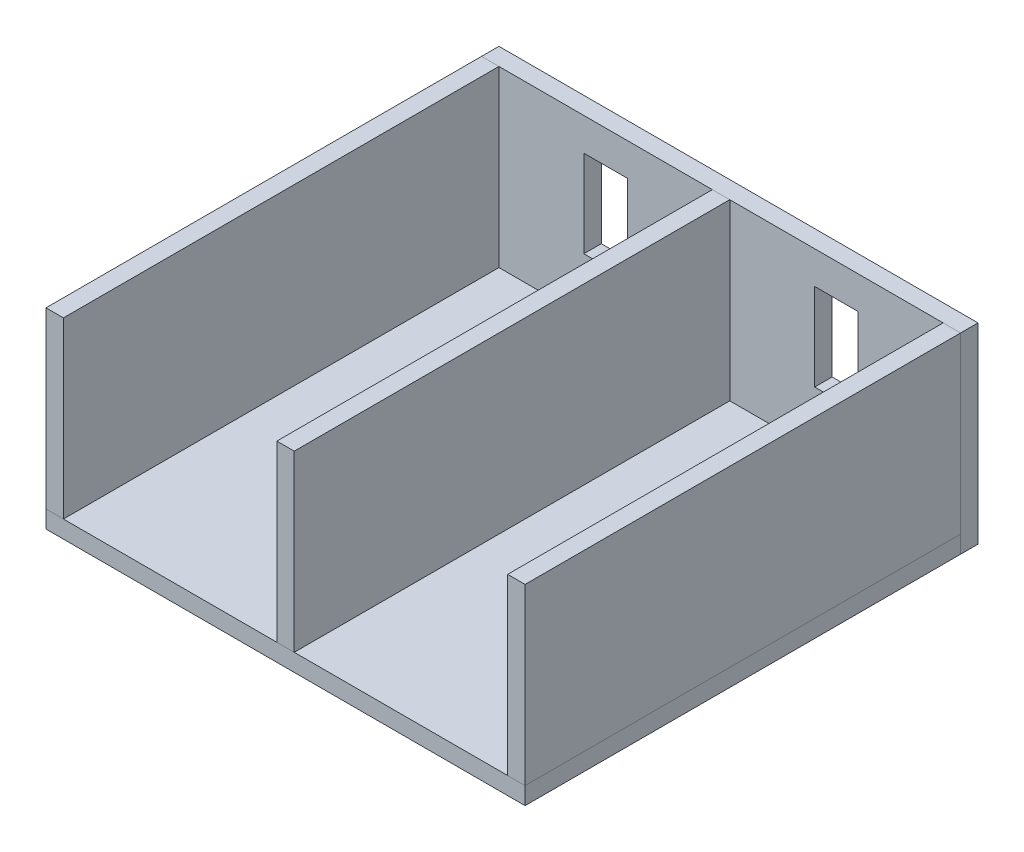
ISO-10303-21;
HEADER;
FILE_DESCRIPTION(('STEP AP214'),'2;1');
FILE_NAME('part.step','',(''),(''),'','','');
FILE_SCHEMA(('AUTOMOTIVE_DESIGN { 1 0 10303 214 1 1 1 1 }'));
ENDSEC;
DATA;
#1=APPLICATION_CONTEXT('core data for automotive mechanical design processes');
#2=APPLICATION_PROTOCOL_DEFINITION('international standard','automotive_design',2000,#1);
#3=PRODUCT_CONTEXT('',#1,'mechanical');
#4=PRODUCT('Part','Part','',(#3));
#5=PRODUCT_RELATED_PRODUCT_CATEGORY('part','',(#4));
#6=PRODUCT_DEFINITION_FORMATION('','',#4);
#7=PRODUCT_DEFINITION_CONTEXT('part definition',#1,'design');
#8=PRODUCT_DEFINITION('design','',#6,#7);
#9=PRODUCT_DEFINITION_SHAPE('','',#8);
#10=(LENGTH_UNIT() NAMED_UNIT(*) SI_UNIT(.MILLI.,.METRE.));
#11=(NAMED_UNIT(*) PLANE_ANGLE_UNIT() SI_UNIT($,.RADIAN.));
#12=(NAMED_UNIT(*) SI_UNIT($,.STERADIAN.) SOLID_ANGLE_UNIT());
#13=UNCERTAINTY_MEASURE_WITH_UNIT(LENGTH_MEASURE(1.E-05),#10,'distance_accuracy_value','');
#14=(GEOMETRIC_REPRESENTATION_CONTEXT(3) GLOBAL_UNCERTAINTY_ASSIGNED_CONTEXT((#13)) GLOBAL_UNIT_ASSIGNED_CONTEXT((#10,
#11,#12)) REPRESENTATION_CONTEXT('',''));
#15=CARTESIAN_POINT('',(0.,0.,0.));
#16=DIRECTION('',(0.,0.,1.));
#17=DIRECTION('',(1.,0.,0.));
#18=AXIS2_PLACEMENT_3D('',#15,#16,#17);
#19=CARTESIAN_POINT('',(110.,88.,-108.));
#20=DIRECTION('',(-1.,0.,0.));
#21=DIRECTION('',(0.,-1.,0.));
#22=AXIS2_PLACEMENT_3D('',#19,#20,#21);
#23=PLANE('',#22);
#24=DIRECTION('',(0.,-1.,0.));
#25=VECTOR('',#24,1.);
#26=CARTESIAN_POINT('',(110.,88.,-100.));
#27=LINE('',#26,#25);
#28=CARTESIAN_POINT('',(110.,88.,-100.));
#29=VERTEX_POINT('',#28);
#30=CARTESIAN_POINT('',(110.,0.,-100.));
#31=VERTEX_POINT('',#30);
#32=EDGE_CURVE('E176',#29,#31,#27,.T.);
#33=ORIENTED_EDGE('',*,*,#32,.T.);
#34=DIRECTION('',(0.,0.,1.));
#35=VECTOR('',#34,1.);
#36=CARTESIAN_POINT('',(110.,0.,-108.));
#37=LINE('',#36,#35);
#38=CARTESIAN_POINT('',(110.,0.,-108.));
#39=VERTEX_POINT('',#38);
#40=EDGE_CURVE('E243',#39,#31,#37,.T.);
#41=ORIENTED_EDGE('',*,*,#40,.F.);
#42=DIRECTION('',(0.,-1.,0.));
#43=VECTOR('',#42,1.);
#44=CARTESIAN_POINT('',(110.,88.,-108.));
#45=LINE('',#44,#43);
#46=CARTESIAN_POINT('',(110.,88.,-108.));
#47=VERTEX_POINT('',#46);
#48=EDGE_CURVE('E206',#47,#39,#45,.T.);
#49=ORIENTED_EDGE('',*,*,#48,.F.);
#50=DIRECTION('',(0.,0.,1.));
#51=VECTOR('',#50,1.);
#52=CARTESIAN_POINT('',(110.,88.,-108.));
#53=LINE('',#52,#51);
#54=EDGE_CURVE('E220',#47,#29,#53,.T.);
#55=ORIENTED_EDGE('',*,*,#54,.T.);
#56=EDGE_LOOP('',(#33,#41,#49,#55));
#57=FACE_BOUND('',#56,.T.);
#58=ADVANCED_FACE('F49',(#57),#23,.F.);
#59=CARTESIAN_POINT('',(110.,0.,-108.));
#60=DIRECTION('',(0.,1.,0.));
#61=DIRECTION('',(0.,0.,1.));
#62=AXIS2_PLACEMENT_3D('',#59,#60,#61);
#63=PLANE('',#62);
#64=DIRECTION('',(-1.,0.,0.));
#65=VECTOR('',#64,1.);
#66=CARTESIAN_POINT('',(110.,0.,-100.));
#67=LINE('',#66,#65);
#68=CARTESIAN_POINT('',(-110.,0.,-100.));
#69=VERTEX_POINT('',#68);
#70=EDGE_CURVE('E224',#31,#69,#67,.T.);
#71=ORIENTED_EDGE('',*,*,#70,.T.);
#72=DIRECTION('',(0.,0.,1.));
#73=VECTOR('',#72,1.);
#74=CARTESIAN_POINT('',(-110.,0.,-108.));
#75=LINE('',#74,#73);
#76=CARTESIAN_POINT('',(-110.,0.,-108.));
#77=VERTEX_POINT('',#76);
#78=EDGE_CURVE('E239',#77,#69,#75,.T.);
#79=ORIENTED_EDGE('',*,*,#78,.F.);
#80=DIRECTION('',(-1.,0.,0.));
#81=VECTOR('',#80,1.);
#82=CARTESIAN_POINT('',(110.,0.,-108.));
#83=LINE('',#82,#81);
#84=EDGE_CURVE('E210',#39,#77,#83,.T.);
#85=ORIENTED_EDGE('',*,*,#84,.F.);
#86=ORIENTED_EDGE('',*,*,#40,.T.);
#87=EDGE_LOOP('',(#71,#79,#85,#86));
#88=FACE_BOUND('',#87,.T.);
#89=ADVANCED_FACE('F289',(#88),#63,.F.);
#90=CARTESIAN_POINT('',(-110.,88.,-108.));
#91=DIRECTION('',(1.,0.,0.));
#92=DIRECTION('',(0.,1.,0.));
#93=AXIS2_PLACEMENT_3D('',#90,#91,#92);
#94=PLANE('',#93);
#95=DIRECTION('',(0.,1.,0.));
#96=VECTOR('',#95,1.);
#97=CARTESIAN_POINT('',(-110.,88.,-100.));
#98=LINE('',#97,#96);
#99=CARTESIAN_POINT('',(-110.,88.,-100.));
#100=VERTEX_POINT('',#99);
#101=EDGE_CURVE('E227',#69,#100,#98,.T.);
#102=ORIENTED_EDGE('',*,*,#101,.T.);
#103=DIRECTION('',(0.,0.,1.));
#104=VECTOR('',#103,1.);
#105=CARTESIAN_POINT('',(-110.,88.,-108.));
#106=LINE('',#105,#104);
#107=CARTESIAN_POINT('',(-110.,88.,-108.));
#108=VERTEX_POINT('',#107);
#109=EDGE_CURVE('E235',#108,#100,#106,.T.);
#110=ORIENTED_EDGE('',*,*,#109,.F.);
#111=DIRECTION('',(0.,1.,0.));
#112=VECTOR('',#111,1.);
#113=CARTESIAN_POINT('',(-110.,88.,-108.));
#114=LINE('',#113,#112);
#115=EDGE_CURVE('E214',#77,#108,#114,.T.);
#116=ORIENTED_EDGE('',*,*,#115,.F.);
#117=ORIENTED_EDGE('',*,*,#78,.T.);
#118=EDGE_LOOP('',(#102,#110,#116,#117));
#119=FACE_BOUND('',#118,.T.);
#120=ADVANCED_FACE('F294',(#119),#94,.F.);
#121=CARTESIAN_POINT('',(110.,88.,-108.));
#122=DIRECTION('',(0.,-1.,0.));
#123=DIRECTION('',(0.,0.,-1.));
#124=AXIS2_PLACEMENT_3D('',#121,#122,#123);
#125=PLANE('',#124);
#126=DIRECTION('',(1.,0.,0.));
#127=VECTOR('',#126,1.);
#128=CARTESIAN_POINT('',(110.,88.,-100.));
#129=LINE('',#128,#127);
#130=EDGE_CURVE('E211',#100,#29,#129,.T.);
#131=ORIENTED_EDGE('',*,*,#130,.T.);
#132=ORIENTED_EDGE('',*,*,#54,.F.);
#133=DIRECTION('',(1.,0.,0.));
#134=VECTOR('',#133,1.);
#135=CARTESIAN_POINT('',(110.,88.,-108.));
#136=LINE('',#135,#134);
#137=EDGE_CURVE('E217',#108,#47,#136,.T.);
#138=ORIENTED_EDGE('',*,*,#137,.F.);
#139=ORIENTED_EDGE('',*,*,#109,.T.);
#140=EDGE_LOOP('',(#131,#132,#138,#139));
#141=FACE_BOUND('',#140,.T.);
#142=ADVANCED_FACE('F309',(#141),#125,.F.);
#143=CARTESIAN_POINT('',(0.,0.,-108.));
#144=DIRECTION('',(0.,0.,-1.));
#145=DIRECTION('',(-1.,0.,0.));
#146=AXIS2_PLACEMENT_3D('',#143,#144,#145);
#147=PLANE('',#146);
#148=DIRECTION('',(0.,-1.,0.));
#149=VECTOR('',#148,1.);
#150=CARTESIAN_POINT('',(-43.,33.,-108.));
#151=LINE('',#150,#149);
#152=CARTESIAN_POINT('',(-43.,73.,-108.));
#153=VERTEX_POINT('',#152);
#154=CARTESIAN_POINT('',(-43.,33.,-108.));
#155=VERTEX_POINT('',#154);
#156=EDGE_CURVE('E64',#153,#155,#151,.T.);
#157=ORIENTED_EDGE('',*,*,#156,.F.);
#158=DIRECTION('',(1.,0.,0.));
#159=VECTOR('',#158,1.);
#160=CARTESIAN_POINT('',(-63.,73.,-108.));
#161=LINE('',#160,#159);
#162=CARTESIAN_POINT('',(-63.,73.,-108.));
#163=VERTEX_POINT('',#162);
#164=EDGE_CURVE('E164',#163,#153,#161,.T.);
#165=ORIENTED_EDGE('',*,*,#164,.F.);
#166=DIRECTION('',(0.,1.,0.));
#167=VECTOR('',#166,1.);
#168=CARTESIAN_POINT('',(-63.,33.,-108.));
#169=LINE('',#168,#167);
#170=CARTESIAN_POINT('',(-63.,33.,-108.));
#171=VERTEX_POINT('',#170);
#172=EDGE_CURVE('E145',#171,#163,#169,.T.);
#173=ORIENTED_EDGE('',*,*,#172,.F.);
#174=DIRECTION('',(-1.,0.,0.));
#175=VECTOR('',#174,1.);
#176=CARTESIAN_POINT('',(-63.,33.,-108.));
#177=LINE('',#176,#175);
#178=EDGE_CURVE('E156',#155,#171,#177,.T.);
#179=ORIENTED_EDGE('',*,*,#178,.F.);
#180=EDGE_LOOP('',(#157,#165,#173,#179));
#181=FACE_BOUND('',#180,.T.);
#182=DIRECTION('',(0.,-1.,0.));
#183=VECTOR('',#182,1.);
#184=CARTESIAN_POINT('',(63.,33.,-108.));
#185=LINE('',#184,#183);
#186=CARTESIAN_POINT('',(63.,73.,-108.));
#187=VERTEX_POINT('',#186);
#188=CARTESIAN_POINT('',(63.,33.,-108.));
#189=VERTEX_POINT('',#188);
#190=EDGE_CURVE('E72',#187,#189,#185,.T.);
#191=ORIENTED_EDGE('',*,*,#190,.F.);
#192=DIRECTION('',(1.,0.,0.));
#193=VECTOR('',#192,1.);
#194=CARTESIAN_POINT('',(43.,73.,-108.));
#195=LINE('',#194,#193);
#196=CARTESIAN_POINT('',(43.,73.,-108.));
#197=VERTEX_POINT('',#196);
#198=EDGE_CURVE('E191',#197,#187,#195,.T.);
#199=ORIENTED_EDGE('',*,*,#198,.F.);
#200=DIRECTION('',(0.,1.,0.));
#201=VECTOR('',#200,1.);
#202=CARTESIAN_POINT('',(43.,33.,-108.));
#203=LINE('',#202,#201);
#204=CARTESIAN_POINT('',(43.,33.,-108.));
#205=VERTEX_POINT('',#204);
#206=EDGE_CURVE('E187',#205,#197,#203,.T.);
#207=ORIENTED_EDGE('',*,*,#206,.F.);
#208=DIRECTION('',(-1.,0.,0.));
#209=VECTOR('',#208,1.);
#210=CARTESIAN_POINT('',(43.,33.,-108.));
#211=LINE('',#210,#209);
#212=EDGE_CURVE('E183',#189,#205,#211,.T.);
#213=ORIENTED_EDGE('',*,*,#212,.F.);
#214=EDGE_LOOP('',(#191,#199,#207,#213));
#215=FACE_BOUND('',#214,.T.);
#216=ORIENTED_EDGE('',*,*,#48,.T.);
#217=ORIENTED_EDGE('',*,*,#84,.T.);
#218=ORIENTED_EDGE('',*,*,#115,.T.);
#219=ORIENTED_EDGE('',*,*,#137,.T.);
#220=EDGE_LOOP('',(#216,#217,#218,#219));
#221=FACE_BOUND('',#220,.T.);
#222=ADVANCED_FACE('F161',(#181,#215,#221),#147,.T.);
#223=CARTESIAN_POINT('',(0.,0.,-100.));
#224=DIRECTION('',(0.,0.,-1.));
#225=DIRECTION('',(-1.,0.,0.));
#226=AXIS2_PLACEMENT_3D('',#223,#224,#225);
#227=PLANE('',#226);
#228=DIRECTION('',(1.,0.,0.));
#229=VECTOR('',#228,1.);
#230=CARTESIAN_POINT('',(0.,73.,-100.));
#231=LINE('',#230,#229);
#232=CARTESIAN_POINT('',(-63.,73.,-100.));
#233=VERTEX_POINT('',#232);
#234=CARTESIAN_POINT('',(-43.,73.,-100.));
#235=VERTEX_POINT('',#234);
#236=EDGE_CURVE('E57',#233,#235,#231,.T.);
#237=ORIENTED_EDGE('',*,*,#236,.T.);
#238=DIRECTION('',(0.,-1.,0.));
#239=VECTOR('',#238,1.);
#240=CARTESIAN_POINT('',(-43.,0.,-100.));
#241=LINE('',#240,#239);
#242=CARTESIAN_POINT('',(-43.,33.,-100.));
#243=VERTEX_POINT('',#242);
#244=EDGE_CURVE('E12',#235,#243,#241,.T.);
#245=ORIENTED_EDGE('',*,*,#244,.T.);
#246=DIRECTION('',(-1.,0.,0.));
#247=VECTOR('',#246,1.);
#248=CARTESIAN_POINT('',(0.,33.,-100.));
#249=LINE('',#248,#247);
#250=CARTESIAN_POINT('',(-63.,33.,-100.));
#251=VERTEX_POINT('',#250);
#252=EDGE_CURVE('E262',#243,#251,#249,.T.);
#253=ORIENTED_EDGE('',*,*,#252,.T.);
#254=DIRECTION('',(0.,1.,0.));
#255=VECTOR('',#254,1.);
#256=CARTESIAN_POINT('',(-63.,0.,-100.));
#257=LINE('',#256,#255);
#258=EDGE_CURVE('E148',#251,#233,#257,.T.);
#259=ORIENTED_EDGE('',*,*,#258,.T.);
#260=EDGE_LOOP('',(#237,#245,#253,#259));
#261=FACE_BOUND('',#260,.T.);
#262=DIRECTION('',(1.,0.,0.));
#263=VECTOR('',#262,1.);
#264=CARTESIAN_POINT('',(0.,73.,-100.));
#265=LINE('',#264,#263);
#266=CARTESIAN_POINT('',(43.,73.,-100.));
#267=VERTEX_POINT('',#266);
#268=CARTESIAN_POINT('',(63.,73.,-100.));
#269=VERTEX_POINT('',#268);
#270=EDGE_CURVE('E255',#267,#269,#265,.T.);
#271=ORIENTED_EDGE('',*,*,#270,.T.);
#272=DIRECTION('',(0.,-1.,0.));
#273=VECTOR('',#272,1.);
#274=CARTESIAN_POINT('',(63.,0.,-100.));
#275=LINE('',#274,#273);
#276=CARTESIAN_POINT('',(63.,33.,-100.));
#277=VERTEX_POINT('',#276);
#278=EDGE_CURVE('E258',#269,#277,#275,.T.);
#279=ORIENTED_EDGE('',*,*,#278,.T.);
#280=DIRECTION('',(-1.,0.,0.));
#281=VECTOR('',#280,1.);
#282=CARTESIAN_POINT('',(0.,33.,-100.));
#283=LINE('',#282,#281);
#284=CARTESIAN_POINT('',(43.,33.,-100.));
#285=VERTEX_POINT('',#284);
#286=EDGE_CURVE('E247',#277,#285,#283,.T.);
#287=ORIENTED_EDGE('',*,*,#286,.T.);
#288=DIRECTION('',(0.,1.,0.));
#289=VECTOR('',#288,1.);
#290=CARTESIAN_POINT('',(43.,0.,-100.));
#291=LINE('',#290,#289);
#292=EDGE_CURVE('E251',#285,#267,#291,.T.);
#293=ORIENTED_EDGE('',*,*,#292,.T.);
#294=EDGE_LOOP('',(#271,#279,#287,#293));
#295=FACE_BOUND('',#294,.T.);
#296=ORIENTED_EDGE('',*,*,#32,.F.);
#297=ORIENTED_EDGE('',*,*,#130,.F.);
#298=ORIENTED_EDGE('',*,*,#101,.F.);
#299=ORIENTED_EDGE('',*,*,#70,.F.);
#300=EDGE_LOOP('',(#296,#297,#298,#299));
#301=FACE_BOUND('',#300,.T.);
#302=ADVANCED_FACE('F269',(#261,#295,#301),#227,.F.);
#303=CARTESIAN_POINT('',(63.,33.,100.));
#304=DIRECTION('',(1.,0.,0.));
#305=DIRECTION('',(0.,0.,-1.));
#306=AXIS2_PLACEMENT_3D('',#303,#304,#305);
#307=PLANE('',#306);
#308=DIRECTION('',(0.,0.,-1.));
#309=VECTOR('',#308,1.);
#310=CARTESIAN_POINT('',(63.,73.,100.));
#311=LINE('',#310,#309);
#312=EDGE_CURVE('E196',#269,#187,#311,.T.);
#313=ORIENTED_EDGE('',*,*,#312,.T.);
#314=ORIENTED_EDGE('',*,*,#190,.T.);
#315=DIRECTION('',(0.,0.,-1.));
#316=VECTOR('',#315,1.);
#317=CARTESIAN_POINT('',(63.,33.,100.));
#318=LINE('',#317,#316);
#319=EDGE_CURVE('E195',#277,#189,#318,.T.);
#320=ORIENTED_EDGE('',*,*,#319,.F.);
#321=ORIENTED_EDGE('',*,*,#278,.F.);
#322=EDGE_LOOP('',(#313,#314,#320,#321));
#323=FACE_BOUND('',#322,.T.);
#324=ADVANCED_FACE('F320',(#323),#307,.F.);
#325=CARTESIAN_POINT('',(43.,73.,100.));
#326=DIRECTION('',(0.,1.,0.));
#327=DIRECTION('',(0.,0.,1.));
#328=AXIS2_PLACEMENT_3D('',#325,#326,#327);
#329=PLANE('',#328);
#330=DIRECTION('',(0.,0.,-1.));
#331=VECTOR('',#330,1.);
#332=CARTESIAN_POINT('',(43.,73.,100.));
#333=LINE('',#332,#331);
#334=EDGE_CURVE('E199',#267,#197,#333,.T.);
#335=ORIENTED_EDGE('',*,*,#334,.T.);
#336=ORIENTED_EDGE('',*,*,#198,.T.);
#337=ORIENTED_EDGE('',*,*,#312,.F.);
#338=ORIENTED_EDGE('',*,*,#270,.F.);
#339=EDGE_LOOP('',(#335,#336,#337,#338));
#340=FACE_BOUND('',#339,.T.);
#341=ADVANCED_FACE('F324',(#340),#329,.F.);
#342=CARTESIAN_POINT('',(43.,33.,100.));
#343=DIRECTION('',(-1.,0.,0.));
#344=DIRECTION('',(0.,0.,1.));
#345=AXIS2_PLACEMENT_3D('',#342,#343,#344);
#346=PLANE('',#345);
#347=DIRECTION('',(0.,0.,-1.));
#348=VECTOR('',#347,1.);
#349=CARTESIAN_POINT('',(43.,33.,100.));
#350=LINE('',#349,#348);
#351=EDGE_CURVE('E201',#285,#205,#350,.T.);
#352=ORIENTED_EDGE('',*,*,#351,.T.);
#353=ORIENTED_EDGE('',*,*,#206,.T.);
#354=ORIENTED_EDGE('',*,*,#334,.F.);
#355=ORIENTED_EDGE('',*,*,#292,.F.);
#356=EDGE_LOOP('',(#352,#353,#354,#355));
#357=FACE_BOUND('',#356,.T.);
#358=ADVANCED_FACE('F283',(#357),#346,.F.);
#359=CARTESIAN_POINT('',(43.,33.,100.));
#360=DIRECTION('',(0.,-1.,0.));
#361=DIRECTION('',(0.,0.,-1.));
#362=AXIS2_PLACEMENT_3D('',#359,#360,#361);
#363=PLANE('',#362);
#364=ORIENTED_EDGE('',*,*,#319,.T.);
#365=ORIENTED_EDGE('',*,*,#212,.T.);
#366=ORIENTED_EDGE('',*,*,#351,.F.);
#367=ORIENTED_EDGE('',*,*,#286,.F.);
#368=EDGE_LOOP('',(#364,#365,#366,#367));
#369=FACE_BOUND('',#368,.T.);
#370=ADVANCED_FACE('F276',(#369),#363,.F.);
#371=CARTESIAN_POINT('',(-43.,33.,100.));
#372=DIRECTION('',(1.,0.,0.));
#373=DIRECTION('',(0.,0.,-1.));
#374=AXIS2_PLACEMENT_3D('',#371,#372,#373);
#375=PLANE('',#374);
#376=DIRECTION('',(0.,0.,-1.));
#377=VECTOR('',#376,1.);
#378=CARTESIAN_POINT('',(-43.,73.,100.));
#379=LINE('',#378,#377);
#380=EDGE_CURVE('E173',#235,#153,#379,.T.);
#381=ORIENTED_EDGE('',*,*,#380,.T.);
#382=ORIENTED_EDGE('',*,*,#156,.T.);
#383=DIRECTION('',(0.,0.,-1.));
#384=VECTOR('',#383,1.);
#385=CARTESIAN_POINT('',(-43.,33.,100.));
#386=LINE('',#385,#384);
#387=EDGE_CURVE('E153',#243,#155,#386,.T.);
#388=ORIENTED_EDGE('',*,*,#387,.F.);
#389=ORIENTED_EDGE('',*,*,#244,.F.);
#390=EDGE_LOOP('',(#381,#382,#388,#389));
#391=FACE_BOUND('',#390,.T.);
#392=ADVANCED_FACE('F274',(#391),#375,.F.);
#393=CARTESIAN_POINT('',(-63.,73.,100.));
#394=DIRECTION('',(0.,1.,0.));
#395=DIRECTION('',(0.,0.,1.));
#396=AXIS2_PLACEMENT_3D('',#393,#394,#395);
#397=PLANE('',#396);
#398=DIRECTION('',(0.,0.,-1.));
#399=VECTOR('',#398,1.);
#400=CARTESIAN_POINT('',(-63.,73.,100.));
#401=LINE('',#400,#399);
#402=EDGE_CURVE('E152',#233,#163,#401,.T.);
#403=ORIENTED_EDGE('',*,*,#402,.T.);
#404=ORIENTED_EDGE('',*,*,#164,.T.);
#405=ORIENTED_EDGE('',*,*,#380,.F.);
#406=ORIENTED_EDGE('',*,*,#236,.F.);
#407=EDGE_LOOP('',(#403,#404,#405,#406));
#408=FACE_BOUND('',#407,.T.);
#409=ADVANCED_FACE('F273',(#408),#397,.F.);
#410=CARTESIAN_POINT('',(-63.,33.,100.));
#411=DIRECTION('',(-1.,0.,0.));
#412=DIRECTION('',(0.,0.,1.));
#413=AXIS2_PLACEMENT_3D('',#410,#411,#412);
#414=PLANE('',#413);
#415=DIRECTION('',(0.,0.,-1.));
#416=VECTOR('',#415,1.);
#417=CARTESIAN_POINT('',(-63.,33.,100.));
#418=LINE('',#417,#416);
#419=EDGE_CURVE('E140',#251,#171,#418,.T.);
#420=ORIENTED_EDGE('',*,*,#419,.T.);
#421=ORIENTED_EDGE('',*,*,#172,.T.);
#422=ORIENTED_EDGE('',*,*,#402,.F.);
#423=ORIENTED_EDGE('',*,*,#258,.F.);
#424=EDGE_LOOP('',(#420,#421,#422,#423));
#425=FACE_BOUND('',#424,.T.);
#426=ADVANCED_FACE('F142',(#425),#414,.F.);
#427=CARTESIAN_POINT('',(-63.,33.,100.));
#428=DIRECTION('',(0.,-1.,0.));
#429=DIRECTION('',(0.,0.,-1.));
#430=AXIS2_PLACEMENT_3D('',#427,#428,#429);
#431=PLANE('',#430);
#432=ORIENTED_EDGE('',*,*,#387,.T.);
#433=ORIENTED_EDGE('',*,*,#178,.T.);
#434=ORIENTED_EDGE('',*,*,#419,.F.);
#435=ORIENTED_EDGE('',*,*,#252,.F.);
#436=EDGE_LOOP('',(#432,#433,#434,#435));
#437=FACE_BOUND('',#436,.T.);
#438=ADVANCED_FACE('F157',(#437),#431,.F.);
#439=CLOSED_SHELL('',(#58,#89,#120,#142,#222,#302,#324,#341,#358,#370,#392,#409,#426,#438));
#440=MANIFOLD_SOLID_BREP('B2',#439);
#441=CARTESIAN_POINT('',(4.,88.,100.));
#442=DIRECTION('',(-1.,0.,0.));
#443=DIRECTION('',(0.,0.,1.));
#444=AXIS2_PLACEMENT_3D('',#441,#442,#443);
#445=PLANE('',#444);
#446=DIRECTION('',(0.,0.,-1.));
#447=VECTOR('',#446,1.);
#448=CARTESIAN_POINT('',(4.,8.,100.));
#449=LINE('',#448,#447);
#450=CARTESIAN_POINT('',(4.,8.,100.));
#451=VERTEX_POINT('',#450);
#452=CARTESIAN_POINT('',(4.,8.,-100.));
#453=VERTEX_POINT('',#452);
#454=EDGE_CURVE('E513',#451,#453,#449,.T.);
#455=ORIENTED_EDGE('',*,*,#454,.T.);
#456=DIRECTION('',(0.,-1.,0.));
#457=VECTOR('',#456,1.);
#458=CARTESIAN_POINT('',(4.,88.,-100.));
#459=LINE('',#458,#457);
#460=CARTESIAN_POINT('',(4.,88.,-100.));
#461=VERTEX_POINT('',#460);
#462=EDGE_CURVE('E47',#461,#453,#459,.T.);
#463=ORIENTED_EDGE('',*,*,#462,.F.);
#464=DIRECTION('',(0.,0.,-1.));
#465=VECTOR('',#464,1.);
#466=CARTESIAN_POINT('',(4.,88.,100.));
#467=LINE('',#466,#465);
#468=CARTESIAN_POINT('',(4.,88.,100.));
#469=VERTEX_POINT('',#468);
#470=EDGE_CURVE('E496',#469,#461,#467,.T.);
#471=ORIENTED_EDGE('',*,*,#470,.F.);
#472=DIRECTION('',(0.,-1.,0.));
#473=VECTOR('',#472,1.);
#474=CARTESIAN_POINT('',(4.,88.,100.));
#475=LINE('',#474,#473);
#476=EDGE_CURVE('E509',#469,#451,#475,.T.);
#477=ORIENTED_EDGE('',*,*,#476,.T.);
#478=EDGE_LOOP('',(#455,#463,#471,#477));
#479=FACE_BOUND('',#478,.T.);
#480=ADVANCED_FACE('F444',(#479),#445,.F.);
#481=CARTESIAN_POINT('',(-4.,88.,-100.));
#482=DIRECTION('',(0.,0.,1.));
#483=DIRECTION('',(1.,0.,0.));
#484=AXIS2_PLACEMENT_3D('',#481,#482,#483);
#485=PLANE('',#484);
#486=DIRECTION('',(-1.,0.,0.));
#487=VECTOR('',#486,1.);
#488=CARTESIAN_POINT('',(-4.,8.,-100.));
#489=LINE('',#488,#487);
#490=CARTESIAN_POINT('',(-4.,8.,-100.));
#491=VERTEX_POINT('',#490);
#492=EDGE_CURVE('E501',#453,#491,#489,.T.);
#493=ORIENTED_EDGE('',*,*,#492,.T.);
#494=DIRECTION('',(0.,-1.,0.));
#495=VECTOR('',#494,1.);
#496=CARTESIAN_POINT('',(-4.,88.,-100.));
#497=LINE('',#496,#495);
#498=CARTESIAN_POINT('',(-4.,88.,-100.));
#499=VERTEX_POINT('',#498);
#500=EDGE_CURVE('E453',#499,#491,#497,.T.);
#501=ORIENTED_EDGE('',*,*,#500,.F.);
#502=DIRECTION('',(-1.,0.,0.));
#503=VECTOR('',#502,1.);
#504=CARTESIAN_POINT('',(-4.,88.,-100.));
#505=LINE('',#504,#503);
#506=EDGE_CURVE('E491',#461,#499,#505,.T.);
#507=ORIENTED_EDGE('',*,*,#506,.F.);
#508=ORIENTED_EDGE('',*,*,#462,.T.);
#509=EDGE_LOOP('',(#493,#501,#507,#508));
#510=FACE_BOUND('',#509,.T.);
#511=ADVANCED_FACE('F500',(#510),#485,.F.);
#512=CARTESIAN_POINT('',(-4.,88.,100.));
#513=DIRECTION('',(1.,0.,0.));
#514=DIRECTION('',(0.,0.,-1.));
#515=AXIS2_PLACEMENT_3D('',#512,#513,#514);
#516=PLANE('',#515);
#517=DIRECTION('',(0.,0.,1.));
#518=VECTOR('',#517,1.);
#519=CARTESIAN_POINT('',(-4.,8.,100.));
#520=LINE('',#519,#518);
#521=CARTESIAN_POINT('',(-4.,8.,100.));
#522=VERTEX_POINT('',#521);
#523=EDGE_CURVE('E478',#491,#522,#520,.T.);
#524=ORIENTED_EDGE('',*,*,#523,.T.);
#525=DIRECTION('',(0.,-1.,0.));
#526=VECTOR('',#525,1.);
#527=CARTESIAN_POINT('',(-4.,88.,100.));
#528=LINE('',#527,#526);
#529=CARTESIAN_POINT('',(-4.,88.,100.));
#530=VERTEX_POINT('',#529);
#531=EDGE_CURVE('E503',#530,#522,#528,.T.);
#532=ORIENTED_EDGE('',*,*,#531,.F.);
#533=DIRECTION('',(0.,0.,1.));
#534=VECTOR('',#533,1.);
#535=CARTESIAN_POINT('',(-4.,88.,100.));
#536=LINE('',#535,#534);
#537=EDGE_CURVE('E494',#499,#530,#536,.T.);
#538=ORIENTED_EDGE('',*,*,#537,.F.);
#539=ORIENTED_EDGE('',*,*,#500,.T.);
#540=EDGE_LOOP('',(#524,#532,#538,#539));
#541=FACE_BOUND('',#540,.T.);
#542=ADVANCED_FACE('F504',(#541),#516,.F.);
#543=CARTESIAN_POINT('',(-4.,88.,100.));
#544=DIRECTION('',(0.,0.,-1.));
#545=DIRECTION('',(-1.,0.,0.));
#546=AXIS2_PLACEMENT_3D('',#543,#544,#545);
#547=PLANE('',#546);
#548=DIRECTION('',(1.,0.,0.));
#549=VECTOR('',#548,1.);
#550=CARTESIAN_POINT('',(-4.,8.,100.));
#551=LINE('',#550,#549);
#552=EDGE_CURVE('E484',#522,#451,#551,.T.);
#553=ORIENTED_EDGE('',*,*,#552,.T.);
#554=ORIENTED_EDGE('',*,*,#476,.F.);
#555=DIRECTION('',(1.,0.,0.));
#556=VECTOR('',#555,1.);
#557=CARTESIAN_POINT('',(-4.,88.,100.));
#558=LINE('',#557,#556);
#559=EDGE_CURVE('E461',#530,#469,#558,.T.);
#560=ORIENTED_EDGE('',*,*,#559,.F.);
#561=ORIENTED_EDGE('',*,*,#531,.T.);
#562=EDGE_LOOP('',(#553,#554,#560,#561));
#563=FACE_BOUND('',#562,.T.);
#564=ADVANCED_FACE('F526',(#563),#547,.F.);
#565=CARTESIAN_POINT('',(0.,88.,0.));
#566=DIRECTION('',(0.,-1.,0.));
#567=DIRECTION('',(0.,0.,-1.));
#568=AXIS2_PLACEMENT_3D('',#565,#566,#567);
#569=PLANE('',#568);
#570=ORIENTED_EDGE('',*,*,#470,.T.);
#571=ORIENTED_EDGE('',*,*,#506,.T.);
#572=ORIENTED_EDGE('',*,*,#537,.T.);
#573=ORIENTED_EDGE('',*,*,#559,.T.);
#574=EDGE_LOOP('',(#570,#571,#572,#573));
#575=FACE_BOUND('',#574,.T.);
#576=ADVANCED_FACE('F492',(#575),#569,.F.);
#577=CARTESIAN_POINT('',(0.,8.,0.));
#578=DIRECTION('',(0.,-1.,0.));
#579=DIRECTION('',(0.,0.,-1.));
#580=AXIS2_PLACEMENT_3D('',#577,#578,#579);
#581=PLANE('',#580);
#582=ORIENTED_EDGE('',*,*,#454,.F.);
#583=ORIENTED_EDGE('',*,*,#552,.F.);
#584=ORIENTED_EDGE('',*,*,#523,.F.);
#585=ORIENTED_EDGE('',*,*,#492,.F.);
#586=EDGE_LOOP('',(#582,#583,#584,#585));
#587=FACE_BOUND('',#586,.T.);
#588=ADVANCED_FACE('F529',(#587),#581,.T.);
#589=CLOSED_SHELL('',(#480,#511,#542,#564,#576,#588));
#590=MANIFOLD_SOLID_BREP('B6',#589);
#591=CARTESIAN_POINT('',(110.,88.,100.));
#592=DIRECTION('',(-1.,0.,0.));
#593=DIRECTION('',(0.,0.,1.));
#594=AXIS2_PLACEMENT_3D('',#591,#592,#593);
#595=PLANE('',#594);
#596=DIRECTION('',(0.,0.,-1.));
#597=VECTOR('',#596,1.);
#598=CARTESIAN_POINT('',(110.,8.,100.));
#599=LINE('',#598,#597);
#600=CARTESIAN_POINT('',(110.,8.,100.));
#601=VERTEX_POINT('',#600);
#602=CARTESIAN_POINT('',(110.,8.,-100.));
#603=VERTEX_POINT('',#602);
#604=EDGE_CURVE('E667',#601,#603,#599,.T.);
#605=ORIENTED_EDGE('',*,*,#604,.T.);
#606=DIRECTION('',(0.,-1.,0.));
#607=VECTOR('',#606,1.);
#608=CARTESIAN_POINT('',(110.,88.,-100.));
#609=LINE('',#608,#607);
#610=CARTESIAN_POINT('',(110.,88.,-100.));
#611=VERTEX_POINT('',#610);
#612=EDGE_CURVE('E442',#611,#603,#609,.T.);
#613=ORIENTED_EDGE('',*,*,#612,.F.);
#614=DIRECTION('',(0.,0.,-1.));
#615=VECTOR('',#614,1.);
#616=CARTESIAN_POINT('',(110.,88.,100.));
#617=LINE('',#616,#615);
#618=CARTESIAN_POINT('',(110.,88.,100.));
#619=VERTEX_POINT('',#618);
#620=EDGE_CURVE('E649',#619,#611,#617,.T.);
#621=ORIENTED_EDGE('',*,*,#620,.F.);
#622=DIRECTION('',(0.,-1.,0.));
#623=VECTOR('',#622,1.);
#624=CARTESIAN_POINT('',(110.,88.,100.));
#625=LINE('',#624,#623);
#626=EDGE_CURVE('E663',#619,#601,#625,.T.);
#627=ORIENTED_EDGE('',*,*,#626,.T.);
#628=EDGE_LOOP('',(#605,#613,#621,#627));
#629=FACE_BOUND('',#628,.T.);
#630=ADVANCED_FACE('F597',(#629),#595,.F.);
#631=CARTESIAN_POINT('',(110.,88.,-100.));
#632=DIRECTION('',(0.,0.,1.));
#633=DIRECTION('',(1.,0.,0.));
#634=AXIS2_PLACEMENT_3D('',#631,#632,#633);
#635=PLANE('',#634);
#636=DIRECTION('',(-1.,0.,0.));
#637=VECTOR('',#636,1.);
#638=CARTESIAN_POINT('',(110.,8.,-100.));
#639=LINE('',#638,#637);
#640=CARTESIAN_POINT('',(102.,8.,-100.));
#641=VERTEX_POINT('',#640);
#642=EDGE_CURVE('E654',#603,#641,#639,.T.);
#643=ORIENTED_EDGE('',*,*,#642,.T.);
#644=DIRECTION('',(0.,-1.,0.));
#645=VECTOR('',#644,1.);
#646=CARTESIAN_POINT('',(102.,88.,-100.));
#647=LINE('',#646,#645);
#648=CARTESIAN_POINT('',(102.,88.,-100.));
#649=VERTEX_POINT('',#648);
#650=EDGE_CURVE('E606',#649,#641,#647,.T.);
#651=ORIENTED_EDGE('',*,*,#650,.F.);
#652=DIRECTION('',(-1.,0.,0.));
#653=VECTOR('',#652,1.);
#654=CARTESIAN_POINT('',(110.,88.,-100.));
#655=LINE('',#654,#653);
#656=EDGE_CURVE('E644',#611,#649,#655,.T.);
#657=ORIENTED_EDGE('',*,*,#656,.F.);
#658=ORIENTED_EDGE('',*,*,#612,.T.);
#659=EDGE_LOOP('',(#643,#651,#657,#658));
#660=FACE_BOUND('',#659,.T.);
#661=ADVANCED_FACE('F653',(#660),#635,.F.);
#662=CARTESIAN_POINT('',(102.,88.,100.));
#663=DIRECTION('',(1.,0.,0.));
#664=DIRECTION('',(0.,0.,-1.));
#665=AXIS2_PLACEMENT_3D('',#662,#663,#664);
#666=PLANE('',#665);
#667=DIRECTION('',(0.,0.,1.));
#668=VECTOR('',#667,1.);
#669=CARTESIAN_POINT('',(102.,8.,100.));
#670=LINE('',#669,#668);
#671=CARTESIAN_POINT('',(102.,8.,100.));
#672=VERTEX_POINT('',#671);
#673=EDGE_CURVE('E631',#641,#672,#670,.T.);
#674=ORIENTED_EDGE('',*,*,#673,.T.);
#675=DIRECTION('',(0.,-1.,0.));
#676=VECTOR('',#675,1.);
#677=CARTESIAN_POINT('',(102.,88.,100.));
#678=LINE('',#677,#676);
#679=CARTESIAN_POINT('',(102.,88.,100.));
#680=VERTEX_POINT('',#679);
#681=EDGE_CURVE('E656',#680,#672,#678,.T.);
#682=ORIENTED_EDGE('',*,*,#681,.F.);
#683=DIRECTION('',(0.,0.,1.));
#684=VECTOR('',#683,1.);
#685=CARTESIAN_POINT('',(102.,88.,100.));
#686=LINE('',#685,#684);
#687=EDGE_CURVE('E647',#649,#680,#686,.T.);
#688=ORIENTED_EDGE('',*,*,#687,.F.);
#689=ORIENTED_EDGE('',*,*,#650,.T.);
#690=EDGE_LOOP('',(#674,#682,#688,#689));
#691=FACE_BOUND('',#690,.T.);
#692=ADVANCED_FACE('F657',(#691),#666,.F.);
#693=CARTESIAN_POINT('',(110.,88.,100.));
#694=DIRECTION('',(0.,0.,-1.));
#695=DIRECTION('',(-1.,0.,0.));
#696=AXIS2_PLACEMENT_3D('',#693,#694,#695);
#697=PLANE('',#696);
#698=DIRECTION('',(1.,0.,0.));
#699=VECTOR('',#698,1.);
#700=CARTESIAN_POINT('',(110.,8.,100.));
#701=LINE('',#700,#699);
#702=EDGE_CURVE('E637',#672,#601,#701,.T.);
#703=ORIENTED_EDGE('',*,*,#702,.T.);
#704=ORIENTED_EDGE('',*,*,#626,.F.);
#705=DIRECTION('',(1.,0.,0.));
#706=VECTOR('',#705,1.);
#707=CARTESIAN_POINT('',(110.,88.,100.));
#708=LINE('',#707,#706);
#709=EDGE_CURVE('E614',#680,#619,#708,.T.);
#710=ORIENTED_EDGE('',*,*,#709,.F.);
#711=ORIENTED_EDGE('',*,*,#681,.T.);
#712=EDGE_LOOP('',(#703,#704,#710,#711));
#713=FACE_BOUND('',#712,.T.);
#714=ADVANCED_FACE('F678',(#713),#697,.F.);
#715=CARTESIAN_POINT('',(0.,88.,0.));
#716=DIRECTION('',(0.,1.,0.));
#717=DIRECTION('',(0.,0.,1.));
#718=AXIS2_PLACEMENT_3D('',#715,#716,#717);
#719=PLANE('',#718);
#720=ORIENTED_EDGE('',*,*,#620,.T.);
#721=ORIENTED_EDGE('',*,*,#656,.T.);
#722=ORIENTED_EDGE('',*,*,#687,.T.);
#723=ORIENTED_EDGE('',*,*,#709,.T.);
#724=EDGE_LOOP('',(#720,#721,#722,#723));
#725=FACE_BOUND('',#724,.T.);
#726=ADVANCED_FACE('F645',(#725),#719,.T.);
#727=CARTESIAN_POINT('',(0.,8.,0.));
#728=DIRECTION('',(0.,1.,0.));
#729=DIRECTION('',(0.,0.,1.));
#730=AXIS2_PLACEMENT_3D('',#727,#728,#729);
#731=PLANE('',#730);
#732=ORIENTED_EDGE('',*,*,#604,.F.);
#733=ORIENTED_EDGE('',*,*,#702,.F.);
#734=ORIENTED_EDGE('',*,*,#673,.F.);
#735=ORIENTED_EDGE('',*,*,#642,.F.);
#736=EDGE_LOOP('',(#732,#733,#734,#735));
#737=FACE_BOUND('',#736,.T.);
#738=ADVANCED_FACE('F681',(#737),#731,.F.);
#739=CLOSED_SHELL('',(#630,#661,#692,#714,#726,#738));
#740=MANIFOLD_SOLID_BREP('B41',#739);
#741=CARTESIAN_POINT('',(-110.,88.,100.));
#742=DIRECTION('',(1.,0.,0.));
#743=DIRECTION('',(0.,0.,-1.));
#744=AXIS2_PLACEMENT_3D('',#741,#742,#743);
#745=PLANE('',#744);
#746=DIRECTION('',(0.,0.,1.));
#747=VECTOR('',#746,1.);
#748=CARTESIAN_POINT('',(-110.,8.,100.));
#749=LINE('',#748,#747);
#750=CARTESIAN_POINT('',(-110.,8.,-100.));
#751=VERTEX_POINT('',#750);
#752=CARTESIAN_POINT('',(-110.,8.,100.));
#753=VERTEX_POINT('',#752);
#754=EDGE_CURVE('E819',#751,#753,#749,.T.);
#755=ORIENTED_EDGE('',*,*,#754,.T.);
#756=DIRECTION('',(0.,-1.,0.));
#757=VECTOR('',#756,1.);
#758=CARTESIAN_POINT('',(-110.,88.,100.));
#759=LINE('',#758,#757);
#760=CARTESIAN_POINT('',(-110.,88.,100.));
#761=VERTEX_POINT('',#760);
#762=EDGE_CURVE('E595',#761,#753,#759,.T.);
#763=ORIENTED_EDGE('',*,*,#762,.F.);
#764=DIRECTION('',(0.,0.,1.));
#765=VECTOR('',#764,1.);
#766=CARTESIAN_POINT('',(-110.,88.,100.));
#767=LINE('',#766,#765);
#768=CARTESIAN_POINT('',(-110.,88.,-100.));
#769=VERTEX_POINT('',#768);
#770=EDGE_CURVE('E801',#769,#761,#767,.T.);
#771=ORIENTED_EDGE('',*,*,#770,.F.);
#772=DIRECTION('',(0.,-1.,0.));
#773=VECTOR('',#772,1.);
#774=CARTESIAN_POINT('',(-110.,88.,-100.));
#775=LINE('',#774,#773);
#776=EDGE_CURVE('E815',#769,#751,#775,.T.);
#777=ORIENTED_EDGE('',*,*,#776,.T.);
#778=EDGE_LOOP('',(#755,#763,#771,#777));
#779=FACE_BOUND('',#778,.T.);
#780=ADVANCED_FACE('F749',(#779),#745,.F.);
#781=CARTESIAN_POINT('',(-110.,88.,100.));
#782=DIRECTION('',(0.,0.,-1.));
#783=DIRECTION('',(-1.,0.,0.));
#784=AXIS2_PLACEMENT_3D('',#781,#782,#783);
#785=PLANE('',#784);
#786=DIRECTION('',(1.,0.,0.));
#787=VECTOR('',#786,1.);
#788=CARTESIAN_POINT('',(-110.,8.,100.));
#789=LINE('',#788,#787);
#790=CARTESIAN_POINT('',(-102.,8.,100.));
#791=VERTEX_POINT('',#790);
#792=EDGE_CURVE('E806',#753,#791,#789,.T.);
#793=ORIENTED_EDGE('',*,*,#792,.T.);
#794=DIRECTION('',(0.,-1.,0.));
#795=VECTOR('',#794,1.);
#796=CARTESIAN_POINT('',(-102.,88.,100.));
#797=LINE('',#796,#795);
#798=CARTESIAN_POINT('',(-102.,88.,100.));
#799=VERTEX_POINT('',#798);
#800=EDGE_CURVE('E758',#799,#791,#797,.T.);
#801=ORIENTED_EDGE('',*,*,#800,.F.);
#802=DIRECTION('',(1.,0.,0.));
#803=VECTOR('',#802,1.);
#804=CARTESIAN_POINT('',(-110.,88.,100.));
#805=LINE('',#804,#803);
#806=EDGE_CURVE('E796',#761,#799,#805,.T.);
#807=ORIENTED_EDGE('',*,*,#806,.F.);
#808=ORIENTED_EDGE('',*,*,#762,.T.);
#809=EDGE_LOOP('',(#793,#801,#807,#808));
#810=FACE_BOUND('',#809,.T.);
#811=ADVANCED_FACE('F805',(#810),#785,.F.);
#812=CARTESIAN_POINT('',(-102.,88.,100.));
#813=DIRECTION('',(-1.,0.,0.));
#814=DIRECTION('',(0.,0.,1.));
#815=AXIS2_PLACEMENT_3D('',#812,#813,#814);
#816=PLANE('',#815);
#817=DIRECTION('',(0.,0.,-1.));
#818=VECTOR('',#817,1.);
#819=CARTESIAN_POINT('',(-102.,8.,100.));
#820=LINE('',#819,#818);
#821=CARTESIAN_POINT('',(-102.,8.,-100.));
#822=VERTEX_POINT('',#821);
#823=EDGE_CURVE('E783',#791,#822,#820,.T.);
#824=ORIENTED_EDGE('',*,*,#823,.T.);
#825=DIRECTION('',(0.,-1.,0.));
#826=VECTOR('',#825,1.);
#827=CARTESIAN_POINT('',(-102.,88.,-100.));
#828=LINE('',#827,#826);
#829=CARTESIAN_POINT('',(-102.,88.,-100.));
#830=VERTEX_POINT('',#829);
#831=EDGE_CURVE('E808',#830,#822,#828,.T.);
#832=ORIENTED_EDGE('',*,*,#831,.F.);
#833=DIRECTION('',(0.,0.,-1.));
#834=VECTOR('',#833,1.);
#835=CARTESIAN_POINT('',(-102.,88.,100.));
#836=LINE('',#835,#834);
#837=EDGE_CURVE('E799',#799,#830,#836,.T.);
#838=ORIENTED_EDGE('',*,*,#837,.F.);
#839=ORIENTED_EDGE('',*,*,#800,.T.);
#840=EDGE_LOOP('',(#824,#832,#838,#839));
#841=FACE_BOUND('',#840,.T.);
#842=ADVANCED_FACE('F809',(#841),#816,.F.);
#843=CARTESIAN_POINT('',(-110.,88.,-100.));
#844=DIRECTION('',(0.,0.,1.));
#845=DIRECTION('',(1.,0.,0.));
#846=AXIS2_PLACEMENT_3D('',#843,#844,#845);
#847=PLANE('',#846);
#848=DIRECTION('',(-1.,0.,0.));
#849=VECTOR('',#848,1.);
#850=CARTESIAN_POINT('',(-110.,8.,-100.));
#851=LINE('',#850,#849);
#852=EDGE_CURVE('E789',#822,#751,#851,.T.);
#853=ORIENTED_EDGE('',*,*,#852,.T.);
#854=ORIENTED_EDGE('',*,*,#776,.F.);
#855=DIRECTION('',(-1.,0.,0.));
#856=VECTOR('',#855,1.);
#857=CARTESIAN_POINT('',(-110.,88.,-100.));
#858=LINE('',#857,#856);
#859=EDGE_CURVE('E766',#830,#769,#858,.T.);
#860=ORIENTED_EDGE('',*,*,#859,.F.);
#861=ORIENTED_EDGE('',*,*,#831,.T.);
#862=EDGE_LOOP('',(#853,#854,#860,#861));
#863=FACE_BOUND('',#862,.T.);
#864=ADVANCED_FACE('F831',(#863),#847,.F.);
#865=CARTESIAN_POINT('',(0.,88.,0.));
#866=DIRECTION('',(0.,-1.,0.));
#867=DIRECTION('',(0.,0.,-1.));
#868=AXIS2_PLACEMENT_3D('',#865,#866,#867);
#869=PLANE('',#868);
#870=ORIENTED_EDGE('',*,*,#770,.T.);
#871=ORIENTED_EDGE('',*,*,#806,.T.);
#872=ORIENTED_EDGE('',*,*,#837,.T.);
#873=ORIENTED_EDGE('',*,*,#859,.T.);
#874=EDGE_LOOP('',(#870,#871,#872,#873));
#875=FACE_BOUND('',#874,.T.);
#876=ADVANCED_FACE('F797',(#875),#869,.F.);
#877=CARTESIAN_POINT('',(0.,8.,0.));
#878=DIRECTION('',(0.,-1.,0.));
#879=DIRECTION('',(0.,0.,-1.));
#880=AXIS2_PLACEMENT_3D('',#877,#878,#879);
#881=PLANE('',#880);
#882=ORIENTED_EDGE('',*,*,#754,.F.);
#883=ORIENTED_EDGE('',*,*,#852,.F.);
#884=ORIENTED_EDGE('',*,*,#823,.F.);
#885=ORIENTED_EDGE('',*,*,#792,.F.);
#886=EDGE_LOOP('',(#882,#883,#884,#885));
#887=FACE_BOUND('',#886,.T.);
#888=ADVANCED_FACE('F834',(#887),#881,.T.);
#889=CLOSED_SHELL('',(#780,#811,#842,#864,#876,#888));
#890=MANIFOLD_SOLID_BREP('B436',#889);
#891=CARTESIAN_POINT('',(110.,8.,100.));
#892=DIRECTION('',(-1.,0.,0.));
#893=DIRECTION('',(0.,0.,1.));
#894=AXIS2_PLACEMENT_3D('',#891,#892,#893);
#895=PLANE('',#894);
#896=DIRECTION('',(0.,0.,-1.));
#897=VECTOR('',#896,1.);
#898=CARTESIAN_POINT('',(110.,0.,100.));
#899=LINE('',#898,#897);
#900=CARTESIAN_POINT('',(110.,0.,100.));
#901=VERTEX_POINT('',#900);
#902=CARTESIAN_POINT('',(110.,0.,-100.));
#903=VERTEX_POINT('',#902);
#904=EDGE_CURVE('E959',#901,#903,#899,.T.);
#905=ORIENTED_EDGE('',*,*,#904,.T.);
#906=DIRECTION('',(0.,-1.,0.));
#907=VECTOR('',#906,1.);
#908=CARTESIAN_POINT('',(110.,8.,-100.));
#909=LINE('',#908,#907);
#910=CARTESIAN_POINT('',(110.,8.,-100.));
#911=VERTEX_POINT('',#910);
#912=EDGE_CURVE('E747',#911,#903,#909,.T.);
#913=ORIENTED_EDGE('',*,*,#912,.F.);
#914=DIRECTION('',(0.,0.,-1.));
#915=VECTOR('',#914,1.);
#916=CARTESIAN_POINT('',(110.,8.,100.));
#917=LINE('',#916,#915);
#918=CARTESIAN_POINT('',(110.,8.,100.));
#919=VERTEX_POINT('',#918);
#920=EDGE_CURVE('E942',#919,#911,#917,.T.);
#921=ORIENTED_EDGE('',*,*,#920,.F.);
#922=DIRECTION('',(0.,-1.,0.));
#923=VECTOR('',#922,1.);
#924=CARTESIAN_POINT('',(110.,8.,100.));
#925=LINE('',#924,#923);
#926=EDGE_CURVE('E955',#919,#901,#925,.T.);
#927=ORIENTED_EDGE('',*,*,#926,.T.);
#928=EDGE_LOOP('',(#905,#913,#921,#927));
#929=FACE_BOUND('',#928,.T.);
#930=ADVANCED_FACE('F890',(#929),#895,.F.);
#931=CARTESIAN_POINT('',(-110.,8.,-100.));
#932=DIRECTION('',(0.,0.,1.));
#933=DIRECTION('',(1.,0.,0.));
#934=AXIS2_PLACEMENT_3D('',#931,#932,#933);
#935=PLANE('',#934);
#936=DIRECTION('',(-1.,0.,0.));
#937=VECTOR('',#936,1.);
#938=CARTESIAN_POINT('',(-110.,0.,-100.));
#939=LINE('',#938,#937);
#940=CARTESIAN_POINT('',(-110.,0.,-100.));
#941=VERTEX_POINT('',#940);
#942=EDGE_CURVE('E947',#903,#941,#939,.T.);
#943=ORIENTED_EDGE('',*,*,#942,.T.);
#944=DIRECTION('',(0.,-1.,0.));
#945=VECTOR('',#944,1.);
#946=CARTESIAN_POINT('',(-110.,8.,-100.));
#947=LINE('',#946,#945);
#948=CARTESIAN_POINT('',(-110.,8.,-100.));
#949=VERTEX_POINT('',#948);
#950=EDGE_CURVE('E899',#949,#941,#947,.T.);
#951=ORIENTED_EDGE('',*,*,#950,.F.);
#952=DIRECTION('',(-1.,0.,0.));
#953=VECTOR('',#952,1.);
#954=CARTESIAN_POINT('',(-110.,8.,-100.));
#955=LINE('',#954,#953);
#956=EDGE_CURVE('E937',#911,#949,#955,.T.);
#957=ORIENTED_EDGE('',*,*,#956,.F.);
#958=ORIENTED_EDGE('',*,*,#912,.T.);
#959=EDGE_LOOP('',(#943,#951,#957,#958));
#960=FACE_BOUND('',#959,.T.);
#961=ADVANCED_FACE('F946',(#960),#935,.F.);
#962=CARTESIAN_POINT('',(-110.,8.,100.));
#963=DIRECTION('',(1.,0.,0.));
#964=DIRECTION('',(0.,0.,-1.));
#965=AXIS2_PLACEMENT_3D('',#962,#963,#964);
#966=PLANE('',#965);
#967=DIRECTION('',(0.,0.,1.));
#968=VECTOR('',#967,1.);
#969=CARTESIAN_POINT('',(-110.,0.,100.));
#970=LINE('',#969,#968);
#971=CARTESIAN_POINT('',(-110.,0.,100.));
#972=VERTEX_POINT('',#971);
#973=EDGE_CURVE('E924',#941,#972,#970,.T.);
#974=ORIENTED_EDGE('',*,*,#973,.T.);
#975=DIRECTION('',(0.,-1.,0.));
#976=VECTOR('',#975,1.);
#977=CARTESIAN_POINT('',(-110.,8.,100.));
#978=LINE('',#977,#976);
#979=CARTESIAN_POINT('',(-110.,8.,100.));
#980=VERTEX_POINT('',#979);
#981=EDGE_CURVE('E949',#980,#972,#978,.T.);
#982=ORIENTED_EDGE('',*,*,#981,.F.);
#983=DIRECTION('',(0.,0.,1.));
#984=VECTOR('',#983,1.);
#985=CARTESIAN_POINT('',(-110.,8.,100.));
#986=LINE('',#985,#984);
#987=EDGE_CURVE('E940',#949,#980,#986,.T.);
#988=ORIENTED_EDGE('',*,*,#987,.F.);
#989=ORIENTED_EDGE('',*,*,#950,.T.);
#990=EDGE_LOOP('',(#974,#982,#988,#989));
#991=FACE_BOUND('',#990,.T.);
#992=ADVANCED_FACE('F950',(#991),#966,.F.);
#993=CARTESIAN_POINT('',(-110.,8.,100.));
#994=DIRECTION('',(0.,0.,-1.));
#995=DIRECTION('',(-1.,0.,0.));
#996=AXIS2_PLACEMENT_3D('',#993,#994,#995);
#997=PLANE('',#996);
#998=DIRECTION('',(1.,0.,0.));
#999=VECTOR('',#998,1.);
#1000=CARTESIAN_POINT('',(-110.,0.,100.));
#1001=LINE('',#1000,#999);
#1002=EDGE_CURVE('E930',#972,#901,#1001,.T.);
#1003=ORIENTED_EDGE('',*,*,#1002,.T.);
#1004=ORIENTED_EDGE('',*,*,#926,.F.);
#1005=DIRECTION('',(1.,0.,0.));
#1006=VECTOR('',#1005,1.);
#1007=CARTESIAN_POINT('',(-110.,8.,100.));
#1008=LINE('',#1007,#1006);
#1009=EDGE_CURVE('E907',#980,#919,#1008,.T.);
#1010=ORIENTED_EDGE('',*,*,#1009,.F.);
#1011=ORIENTED_EDGE('',*,*,#981,.T.);
#1012=EDGE_LOOP('',(#1003,#1004,#1010,#1011));
#1013=FACE_BOUND('',#1012,.T.);
#1014=ADVANCED_FACE('F971',(#1013),#997,.F.);
#1015=CARTESIAN_POINT('',(0.,8.,0.));
#1016=DIRECTION('',(0.,-1.,0.));
#1017=DIRECTION('',(0.,0.,-1.));
#1018=AXIS2_PLACEMENT_3D('',#1015,#1016,#1017);
#1019=PLANE('',#1018);
#1020=ORIENTED_EDGE('',*,*,#920,.T.);
#1021=ORIENTED_EDGE('',*,*,#956,.T.);
#1022=ORIENTED_EDGE('',*,*,#987,.T.);
#1023=ORIENTED_EDGE('',*,*,#1009,.T.);
#1024=EDGE_LOOP('',(#1020,#1021,#1022,#1023));
#1025=FACE_BOUND('',#1024,.T.);
#1026=ADVANCED_FACE('F938',(#1025),#1019,.F.);
#1027=CARTESIAN_POINT('',(0.,0.,0.));
#1028=DIRECTION('',(0.,-1.,0.));
#1029=DIRECTION('',(0.,0.,-1.));
#1030=AXIS2_PLACEMENT_3D('',#1027,#1028,#1029);
#1031=PLANE('',#1030);
#1032=ORIENTED_EDGE('',*,*,#904,.F.);
#1033=ORIENTED_EDGE('',*,*,#1002,.F.);
#1034=ORIENTED_EDGE('',*,*,#973,.F.);
#1035=ORIENTED_EDGE('',*,*,#942,.F.);
#1036=EDGE_LOOP('',(#1032,#1033,#1034,#1035));
#1037=FACE_BOUND('',#1036,.T.);
#1038=ADVANCED_FACE('F974',(#1037),#1031,.T.);
#1039=CLOSED_SHELL('',(#930,#961,#992,#1014,#1026,#1038));
#1040=MANIFOLD_SOLID_BREP('B589',#1039);
#1041=ADVANCED_BREP_SHAPE_REPRESENTATION('',(#18,#440,#590,#740,#890,#1040),#14);
#1042=SHAPE_DEFINITION_REPRESENTATION(#9,#1041);
ENDSEC;
END-ISO-10303-21;
